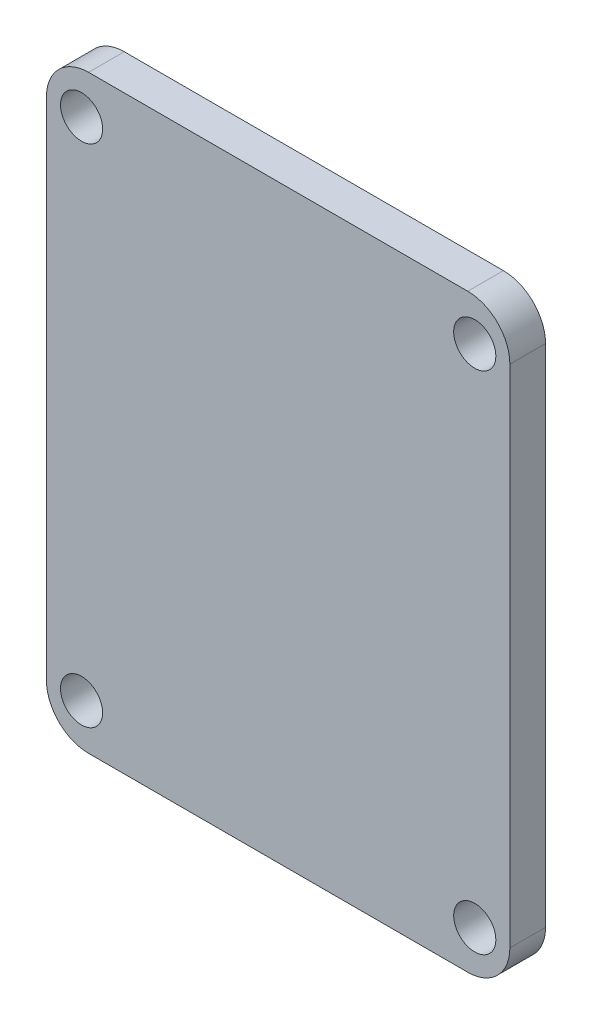
ISO-10303-21;
HEADER;
FILE_DESCRIPTION(('STEP AP214'),'2;1');
FILE_NAME('part.step','',(''),(''),'','','');
FILE_SCHEMA(('AUTOMOTIVE_DESIGN { 1 0 10303 214 1 1 1 1 }'));
ENDSEC;
DATA;
#1=APPLICATION_CONTEXT('core data for automotive mechanical design processes');
#2=APPLICATION_PROTOCOL_DEFINITION('international standard','automotive_design',2000,#1);
#3=PRODUCT_CONTEXT('',#1,'mechanical');
#4=PRODUCT('Part','Part','',(#3));
#5=PRODUCT_RELATED_PRODUCT_CATEGORY('part','',(#4));
#6=PRODUCT_DEFINITION_FORMATION('','',#4);
#7=PRODUCT_DEFINITION_CONTEXT('part definition',#1,'design');
#8=PRODUCT_DEFINITION('design','',#6,#7);
#9=PRODUCT_DEFINITION_SHAPE('','',#8);
#10=(LENGTH_UNIT() NAMED_UNIT(*) SI_UNIT(.MILLI.,.METRE.));
#11=(NAMED_UNIT(*) PLANE_ANGLE_UNIT() SI_UNIT($,.RADIAN.));
#12=(NAMED_UNIT(*) SI_UNIT($,.STERADIAN.) SOLID_ANGLE_UNIT());
#13=UNCERTAINTY_MEASURE_WITH_UNIT(LENGTH_MEASURE(1.E-05),#10,'distance_accuracy_value','');
#14=(GEOMETRIC_REPRESENTATION_CONTEXT(3) GLOBAL_UNCERTAINTY_ASSIGNED_CONTEXT((#13)) GLOBAL_UNIT_ASSIGNED_CONTEXT((#10,
#11,#12)) REPRESENTATION_CONTEXT('',''));
#15=CARTESIAN_POINT('',(0.,0.,0.));
#16=DIRECTION('',(0.,0.,1.));
#17=DIRECTION('',(1.,0.,0.));
#18=AXIS2_PLACEMENT_3D('',#15,#16,#17);
#19=CARTESIAN_POINT('',(0.,0.,2.54));
#20=DIRECTION('',(0.,0.,1.));
#21=DIRECTION('',(1.,0.,0.));
#22=AXIS2_PLACEMENT_3D('',#19,#20,#21);
#23=PLANE('',#22);
#24=CARTESIAN_POINT('',(-14.,18.,2.54));
#25=DIRECTION('',(0.,0.,1.));
#26=DIRECTION('',(1.,0.,0.));
#27=AXIS2_PLACEMENT_3D('',#24,#25,#26);
#28=CIRCLE('',#27,1.5);
#29=CARTESIAN_POINT('',(-12.5,18.,2.54));
#30=VERTEX_POINT('',#29);
#31=EDGE_CURVE('E195',#30,#30,#28,.T.);
#32=ORIENTED_EDGE('',*,*,#31,.F.);
#33=EDGE_LOOP('',(#32));
#34=FACE_BOUND('',#33,.T.);
#35=CARTESIAN_POINT('',(-14.,-18.,2.54));
#36=DIRECTION('',(0.,0.,1.));
#37=DIRECTION('',(1.,0.,0.));
#38=AXIS2_PLACEMENT_3D('',#35,#36,#37);
#39=CIRCLE('',#38,1.5);
#40=CARTESIAN_POINT('',(-12.5,-18.,2.54));
#41=VERTEX_POINT('',#40);
#42=EDGE_CURVE('E135',#41,#41,#39,.T.);
#43=ORIENTED_EDGE('',*,*,#42,.F.);
#44=EDGE_LOOP('',(#43));
#45=FACE_BOUND('',#44,.T.);
#46=DIRECTION('',(0.,1.,0.));
#47=VECTOR('',#46,1.);
#48=CARTESIAN_POINT('',(16.5,-21.,2.54));
#49=LINE('',#48,#47);
#50=CARTESIAN_POINT('',(16.5,-18.,2.54));
#51=VERTEX_POINT('',#50);
#52=CARTESIAN_POINT('',(16.5,18.,2.54));
#53=VERTEX_POINT('',#52);
#54=EDGE_CURVE('E142',#51,#53,#49,.T.);
#55=ORIENTED_EDGE('',*,*,#54,.T.);
#56=CARTESIAN_POINT('',(13.5,18.,2.54));
#57=DIRECTION('',(0.,0.,1.));
#58=DIRECTION('',(1.,0.,0.));
#59=AXIS2_PLACEMENT_3D('',#56,#57,#58);
#60=CIRCLE('',#59,3.);
#61=CARTESIAN_POINT('',(13.5,21.,2.54));
#62=VERTEX_POINT('',#61);
#63=EDGE_CURVE('E161',#53,#62,#60,.T.);
#64=ORIENTED_EDGE('',*,*,#63,.T.);
#65=DIRECTION('',(-1.,0.,0.));
#66=VECTOR('',#65,1.);
#67=CARTESIAN_POINT('',(-16.5,21.,2.54));
#68=LINE('',#67,#66);
#69=CARTESIAN_POINT('',(-13.5,21.,2.54));
#70=VERTEX_POINT('',#69);
#71=EDGE_CURVE('E123',#62,#70,#68,.T.);
#72=ORIENTED_EDGE('',*,*,#71,.T.);
#73=CARTESIAN_POINT('',(-13.5,18.,2.54));
#74=DIRECTION('',(0.,0.,1.));
#75=DIRECTION('',(1.,0.,0.));
#76=AXIS2_PLACEMENT_3D('',#73,#74,#75);
#77=CIRCLE('',#76,3.);
#78=CARTESIAN_POINT('',(-16.5,18.,2.54));
#79=VERTEX_POINT('',#78);
#80=EDGE_CURVE('E157',#70,#79,#77,.T.);
#81=ORIENTED_EDGE('',*,*,#80,.T.);
#82=DIRECTION('',(0.,-1.,0.));
#83=VECTOR('',#82,1.);
#84=CARTESIAN_POINT('',(-16.5,-21.,2.54));
#85=LINE('',#84,#83);
#86=CARTESIAN_POINT('',(-16.5,-18.,2.54));
#87=VERTEX_POINT('',#86);
#88=EDGE_CURVE('E171',#79,#87,#85,.T.);
#89=ORIENTED_EDGE('',*,*,#88,.T.);
#90=CARTESIAN_POINT('',(-13.5,-18.,2.54));
#91=DIRECTION('',(0.,0.,1.));
#92=DIRECTION('',(1.,0.,0.));
#93=AXIS2_PLACEMENT_3D('',#90,#91,#92);
#94=CIRCLE('',#93,3.);
#95=CARTESIAN_POINT('',(-13.5,-21.,2.54));
#96=VERTEX_POINT('',#95);
#97=EDGE_CURVE('E58',#87,#96,#94,.T.);
#98=ORIENTED_EDGE('',*,*,#97,.T.);
#99=DIRECTION('',(1.,0.,0.));
#100=VECTOR('',#99,1.);
#101=CARTESIAN_POINT('',(-16.5,-21.,2.54));
#102=LINE('',#101,#100);
#103=CARTESIAN_POINT('',(13.5,-21.,2.54));
#104=VERTEX_POINT('',#103);
#105=EDGE_CURVE('E178',#96,#104,#102,.T.);
#106=ORIENTED_EDGE('',*,*,#105,.T.);
#107=CARTESIAN_POINT('',(13.5,-18.,2.54));
#108=DIRECTION('',(0.,0.,1.));
#109=DIRECTION('',(1.,0.,0.));
#110=AXIS2_PLACEMENT_3D('',#107,#108,#109);
#111=CIRCLE('',#110,3.);
#112=EDGE_CURVE('E156',#104,#51,#111,.T.);
#113=ORIENTED_EDGE('',*,*,#112,.T.);
#114=EDGE_LOOP('',(#55,#64,#72,#81,#89,#98,#106,#113));
#115=FACE_BOUND('',#114,.T.);
#116=CARTESIAN_POINT('',(14.,-18.,2.54));
#117=DIRECTION('',(0.,0.,1.));
#118=DIRECTION('',(1.,0.,0.));
#119=AXIS2_PLACEMENT_3D('',#116,#117,#118);
#120=CIRCLE('',#119,1.5);
#121=CARTESIAN_POINT('',(15.5,-18.,2.54));
#122=VERTEX_POINT('',#121);
#123=EDGE_CURVE('E186',#122,#122,#120,.T.);
#124=ORIENTED_EDGE('',*,*,#123,.F.);
#125=EDGE_LOOP('',(#124));
#126=FACE_BOUND('',#125,.T.);
#127=CARTESIAN_POINT('',(14.,18.,2.54));
#128=DIRECTION('',(0.,0.,1.));
#129=DIRECTION('',(1.,0.,0.));
#130=AXIS2_PLACEMENT_3D('',#127,#128,#129);
#131=CIRCLE('',#130,1.5);
#132=CARTESIAN_POINT('',(15.5,18.,2.54));
#133=VERTEX_POINT('',#132);
#134=EDGE_CURVE('E196',#133,#133,#131,.T.);
#135=ORIENTED_EDGE('',*,*,#134,.F.);
#136=EDGE_LOOP('',(#135));
#137=FACE_BOUND('',#136,.T.);
#138=ADVANCED_FACE('F39',(#34,#45,#115,#126,#137),#23,.T.);
#139=CARTESIAN_POINT('',(0.,0.,0.));
#140=DIRECTION('',(0.,0.,1.));
#141=DIRECTION('',(1.,0.,0.));
#142=AXIS2_PLACEMENT_3D('',#139,#140,#141);
#143=PLANE('',#142);
#144=DIRECTION('',(-1.,0.,0.));
#145=VECTOR('',#144,1.);
#146=CARTESIAN_POINT('',(-16.5,21.,0.));
#147=LINE('',#146,#145);
#148=CARTESIAN_POINT('',(13.5,21.,0.));
#149=VERTEX_POINT('',#148);
#150=CARTESIAN_POINT('',(-13.5,21.,0.));
#151=VERTEX_POINT('',#150);
#152=EDGE_CURVE('E125',#149,#151,#147,.T.);
#153=ORIENTED_EDGE('',*,*,#152,.F.);
#154=CARTESIAN_POINT('',(13.5,18.,0.));
#155=DIRECTION('',(0.,0.,1.));
#156=DIRECTION('',(1.,0.,0.));
#157=AXIS2_PLACEMENT_3D('',#154,#155,#156);
#158=CIRCLE('',#157,3.);
#159=CARTESIAN_POINT('',(16.5,18.,0.));
#160=VERTEX_POINT('',#159);
#161=EDGE_CURVE('E104',#149,#160,#158,.F.);
#162=ORIENTED_EDGE('',*,*,#161,.T.);
#163=DIRECTION('',(0.,1.,0.));
#164=VECTOR('',#163,1.);
#165=CARTESIAN_POINT('',(16.5,-21.,0.));
#166=LINE('',#165,#164);
#167=CARTESIAN_POINT('',(16.5,-18.,0.));
#168=VERTEX_POINT('',#167);
#169=EDGE_CURVE('E148',#168,#160,#166,.T.);
#170=ORIENTED_EDGE('',*,*,#169,.F.);
#171=CARTESIAN_POINT('',(13.5,-18.,0.));
#172=DIRECTION('',(0.,0.,1.));
#173=DIRECTION('',(1.,0.,0.));
#174=AXIS2_PLACEMENT_3D('',#171,#172,#173);
#175=CIRCLE('',#174,3.);
#176=CARTESIAN_POINT('',(13.5,-21.,0.));
#177=VERTEX_POINT('',#176);
#178=EDGE_CURVE('E127',#168,#177,#175,.F.);
#179=ORIENTED_EDGE('',*,*,#178,.T.);
#180=DIRECTION('',(1.,0.,0.));
#181=VECTOR('',#180,1.);
#182=CARTESIAN_POINT('',(-16.5,-21.,0.));
#183=LINE('',#182,#181);
#184=CARTESIAN_POINT('',(-13.5,-21.,0.));
#185=VERTEX_POINT('',#184);
#186=EDGE_CURVE('E137',#185,#177,#183,.T.);
#187=ORIENTED_EDGE('',*,*,#186,.F.);
#188=CARTESIAN_POINT('',(-13.5,-18.,0.));
#189=DIRECTION('',(0.,0.,1.));
#190=DIRECTION('',(1.,0.,0.));
#191=AXIS2_PLACEMENT_3D('',#188,#189,#190);
#192=CIRCLE('',#191,3.);
#193=CARTESIAN_POINT('',(-16.5,-18.,0.));
#194=VERTEX_POINT('',#193);
#195=EDGE_CURVE('E147',#185,#194,#192,.F.);
#196=ORIENTED_EDGE('',*,*,#195,.T.);
#197=DIRECTION('',(0.,-1.,0.));
#198=VECTOR('',#197,1.);
#199=CARTESIAN_POINT('',(-16.5,-21.,0.));
#200=LINE('',#199,#198);
#201=CARTESIAN_POINT('',(-16.5,18.,0.));
#202=VERTEX_POINT('',#201);
#203=EDGE_CURVE('E131',#202,#194,#200,.T.);
#204=ORIENTED_EDGE('',*,*,#203,.F.);
#205=CARTESIAN_POINT('',(-13.5,18.,0.));
#206=DIRECTION('',(0.,0.,1.));
#207=DIRECTION('',(1.,0.,0.));
#208=AXIS2_PLACEMENT_3D('',#205,#206,#207);
#209=CIRCLE('',#208,3.);
#210=EDGE_CURVE('E119',#202,#151,#209,.F.);
#211=ORIENTED_EDGE('',*,*,#210,.T.);
#212=EDGE_LOOP('',(#153,#162,#170,#179,#187,#196,#204,#211));
#213=FACE_BOUND('',#212,.T.);
#214=CARTESIAN_POINT('',(-14.,-18.,0.));
#215=DIRECTION('',(0.,0.,1.));
#216=DIRECTION('',(1.,0.,0.));
#217=AXIS2_PLACEMENT_3D('',#214,#215,#216);
#218=CIRCLE('',#217,1.5);
#219=CARTESIAN_POINT('',(-12.5,-18.,0.));
#220=VERTEX_POINT('',#219);
#221=EDGE_CURVE('E136',#220,#220,#218,.T.);
#222=ORIENTED_EDGE('',*,*,#221,.T.);
#223=EDGE_LOOP('',(#222));
#224=FACE_BOUND('',#223,.T.);
#225=CARTESIAN_POINT('',(14.,-18.,0.));
#226=DIRECTION('',(0.,0.,1.));
#227=DIRECTION('',(1.,0.,0.));
#228=AXIS2_PLACEMENT_3D('',#225,#226,#227);
#229=CIRCLE('',#228,1.5);
#230=CARTESIAN_POINT('',(15.5,-18.,0.));
#231=VERTEX_POINT('',#230);
#232=EDGE_CURVE('E188',#231,#231,#229,.T.);
#233=ORIENTED_EDGE('',*,*,#232,.T.);
#234=EDGE_LOOP('',(#233));
#235=FACE_BOUND('',#234,.T.);
#236=CARTESIAN_POINT('',(-14.,18.,0.));
#237=DIRECTION('',(0.,0.,1.));
#238=DIRECTION('',(1.,0.,0.));
#239=AXIS2_PLACEMENT_3D('',#236,#237,#238);
#240=CIRCLE('',#239,1.5);
#241=CARTESIAN_POINT('',(-12.5,18.,0.));
#242=VERTEX_POINT('',#241);
#243=EDGE_CURVE('E193',#242,#242,#240,.T.);
#244=ORIENTED_EDGE('',*,*,#243,.T.);
#245=EDGE_LOOP('',(#244));
#246=FACE_BOUND('',#245,.T.);
#247=CARTESIAN_POINT('',(14.,18.,0.));
#248=DIRECTION('',(0.,0.,1.));
#249=DIRECTION('',(1.,0.,0.));
#250=AXIS2_PLACEMENT_3D('',#247,#248,#249);
#251=CIRCLE('',#250,1.5);
#252=CARTESIAN_POINT('',(15.5,18.,0.));
#253=VERTEX_POINT('',#252);
#254=EDGE_CURVE('E203',#253,#253,#251,.T.);
#255=ORIENTED_EDGE('',*,*,#254,.T.);
#256=EDGE_LOOP('',(#255));
#257=FACE_BOUND('',#256,.T.);
#258=ADVANCED_FACE('F129',(#213,#224,#235,#246,#257),#143,.F.);
#259=CARTESIAN_POINT('',(-16.5,21.,2.54));
#260=DIRECTION('',(0.,-1.,0.));
#261=DIRECTION('',(0.,0.,-1.));
#262=AXIS2_PLACEMENT_3D('',#259,#260,#261);
#263=PLANE('',#262);
#264=ORIENTED_EDGE('',*,*,#71,.F.);
#265=DIRECTION('',(0.,0.,-1.));
#266=VECTOR('',#265,1.);
#267=CARTESIAN_POINT('',(13.5,21.,2.54));
#268=LINE('',#267,#266);
#269=EDGE_CURVE('E108',#62,#149,#268,.T.);
#270=ORIENTED_EDGE('',*,*,#269,.T.);
#271=ORIENTED_EDGE('',*,*,#152,.T.);
#272=DIRECTION('',(0.,0.,-1.));
#273=VECTOR('',#272,1.);
#274=CARTESIAN_POINT('',(-13.5,21.,2.54));
#275=LINE('',#274,#273);
#276=EDGE_CURVE('E130',#151,#70,#275,.F.);
#277=ORIENTED_EDGE('',*,*,#276,.T.);
#278=EDGE_LOOP('',(#264,#270,#271,#277));
#279=FACE_BOUND('',#278,.T.);
#280=ADVANCED_FACE('F122',(#279),#263,.F.);
#281=CARTESIAN_POINT('',(-16.5,-21.,2.54));
#282=DIRECTION('',(1.,0.,0.));
#283=DIRECTION('',(0.,0.,-1.));
#284=AXIS2_PLACEMENT_3D('',#281,#282,#283);
#285=PLANE('',#284);
#286=ORIENTED_EDGE('',*,*,#88,.F.);
#287=DIRECTION('',(0.,0.,-1.));
#288=VECTOR('',#287,1.);
#289=CARTESIAN_POINT('',(-16.5,18.,2.54));
#290=LINE('',#289,#288);
#291=EDGE_CURVE('E164',#79,#202,#290,.T.);
#292=ORIENTED_EDGE('',*,*,#291,.T.);
#293=ORIENTED_EDGE('',*,*,#203,.T.);
#294=DIRECTION('',(0.,0.,-1.));
#295=VECTOR('',#294,1.);
#296=CARTESIAN_POINT('',(-16.5,-18.,2.54));
#297=LINE('',#296,#295);
#298=EDGE_CURVE('E162',#194,#87,#297,.F.);
#299=ORIENTED_EDGE('',*,*,#298,.T.);
#300=EDGE_LOOP('',(#286,#292,#293,#299));
#301=FACE_BOUND('',#300,.T.);
#302=ADVANCED_FACE('F168',(#301),#285,.F.);
#303=CARTESIAN_POINT('',(-16.5,-21.,2.54));
#304=DIRECTION('',(0.,1.,0.));
#305=DIRECTION('',(0.,0.,1.));
#306=AXIS2_PLACEMENT_3D('',#303,#304,#305);
#307=PLANE('',#306);
#308=ORIENTED_EDGE('',*,*,#105,.F.);
#309=DIRECTION('',(0.,0.,-1.));
#310=VECTOR('',#309,1.);
#311=CARTESIAN_POINT('',(-13.5,-21.,2.54));
#312=LINE('',#311,#310);
#313=EDGE_CURVE('E11',#96,#185,#312,.T.);
#314=ORIENTED_EDGE('',*,*,#313,.T.);
#315=ORIENTED_EDGE('',*,*,#186,.T.);
#316=DIRECTION('',(0.,0.,-1.));
#317=VECTOR('',#316,1.);
#318=CARTESIAN_POINT('',(13.5,-21.,2.54));
#319=LINE('',#318,#317);
#320=EDGE_CURVE('E50',#177,#104,#319,.F.);
#321=ORIENTED_EDGE('',*,*,#320,.T.);
#322=EDGE_LOOP('',(#308,#314,#315,#321));
#323=FACE_BOUND('',#322,.T.);
#324=ADVANCED_FACE('F176',(#323),#307,.F.);
#325=CARTESIAN_POINT('',(16.5,-21.,2.54));
#326=DIRECTION('',(-1.,0.,0.));
#327=DIRECTION('',(0.,0.,1.));
#328=AXIS2_PLACEMENT_3D('',#325,#326,#327);
#329=PLANE('',#328);
#330=ORIENTED_EDGE('',*,*,#169,.T.);
#331=DIRECTION('',(0.,0.,-1.));
#332=VECTOR('',#331,1.);
#333=CARTESIAN_POINT('',(16.5,18.,2.54));
#334=LINE('',#333,#332);
#335=EDGE_CURVE('E109',#160,#53,#334,.F.);
#336=ORIENTED_EDGE('',*,*,#335,.T.);
#337=ORIENTED_EDGE('',*,*,#54,.F.);
#338=DIRECTION('',(0.,0.,-1.));
#339=VECTOR('',#338,1.);
#340=CARTESIAN_POINT('',(16.5,-18.,2.54));
#341=LINE('',#340,#339);
#342=EDGE_CURVE('E113',#51,#168,#341,.T.);
#343=ORIENTED_EDGE('',*,*,#342,.T.);
#344=EDGE_LOOP('',(#330,#336,#337,#343));
#345=FACE_BOUND('',#344,.T.);
#346=ADVANCED_FACE('F221',(#345),#329,.F.);
#347=CARTESIAN_POINT('',(-14.,-18.,2.54));
#348=DIRECTION('',(0.,0.,-1.));
#349=DIRECTION('',(-1.,0.,0.));
#350=AXIS2_PLACEMENT_3D('',#347,#348,#349);
#351=CYLINDRICAL_SURFACE('',#350,1.5);
#352=ORIENTED_EDGE('',*,*,#42,.T.);
#353=EDGE_LOOP('',(#352));
#354=FACE_BOUND('',#353,.T.);
#355=ORIENTED_EDGE('',*,*,#221,.F.);
#356=EDGE_LOOP('',(#355));
#357=FACE_BOUND('',#356,.T.);
#358=ADVANCED_FACE('F222',(#354,#357),#351,.F.);
#359=CARTESIAN_POINT('',(14.,-18.,2.54));
#360=DIRECTION('',(0.,0.,-1.));
#361=DIRECTION('',(-1.,0.,0.));
#362=AXIS2_PLACEMENT_3D('',#359,#360,#361);
#363=CYLINDRICAL_SURFACE('',#362,1.5);
#364=ORIENTED_EDGE('',*,*,#123,.T.);
#365=EDGE_LOOP('',(#364));
#366=FACE_BOUND('',#365,.T.);
#367=ORIENTED_EDGE('',*,*,#232,.F.);
#368=EDGE_LOOP('',(#367));
#369=FACE_BOUND('',#368,.T.);
#370=ADVANCED_FACE('F248',(#366,#369),#363,.F.);
#371=CARTESIAN_POINT('',(-14.,18.,2.54));
#372=DIRECTION('',(0.,0.,-1.));
#373=DIRECTION('',(-1.,0.,0.));
#374=AXIS2_PLACEMENT_3D('',#371,#372,#373);
#375=CYLINDRICAL_SURFACE('',#374,1.5);
#376=ORIENTED_EDGE('',*,*,#31,.T.);
#377=EDGE_LOOP('',(#376));
#378=FACE_BOUND('',#377,.T.);
#379=ORIENTED_EDGE('',*,*,#243,.F.);
#380=EDGE_LOOP('',(#379));
#381=FACE_BOUND('',#380,.T.);
#382=ADVANCED_FACE('F251',(#378,#381),#375,.F.);
#383=CARTESIAN_POINT('',(14.,18.,2.54));
#384=DIRECTION('',(0.,0.,-1.));
#385=DIRECTION('',(-1.,0.,0.));
#386=AXIS2_PLACEMENT_3D('',#383,#384,#385);
#387=CYLINDRICAL_SURFACE('',#386,1.5);
#388=ORIENTED_EDGE('',*,*,#134,.T.);
#389=EDGE_LOOP('',(#388));
#390=FACE_BOUND('',#389,.T.);
#391=ORIENTED_EDGE('',*,*,#254,.F.);
#392=EDGE_LOOP('',(#391));
#393=FACE_BOUND('',#392,.T.);
#394=ADVANCED_FACE('F210',(#390,#393),#387,.F.);
#395=CARTESIAN_POINT('',(13.5,18.,2.54));
#396=DIRECTION('',(0.,0.,-1.));
#397=DIRECTION('',(-1.,0.,0.));
#398=AXIS2_PLACEMENT_3D('',#395,#396,#397);
#399=CYLINDRICAL_SURFACE('',#398,3.);
#400=ORIENTED_EDGE('',*,*,#63,.F.);
#401=ORIENTED_EDGE('',*,*,#335,.F.);
#402=ORIENTED_EDGE('',*,*,#161,.F.);
#403=ORIENTED_EDGE('',*,*,#269,.F.);
#404=EDGE_LOOP('',(#400,#401,#402,#403));
#405=FACE_BOUND('',#404,.T.);
#406=ADVANCED_FACE('F107',(#405),#399,.T.);
#407=CARTESIAN_POINT('',(-13.5,18.,2.54));
#408=DIRECTION('',(0.,0.,-1.));
#409=DIRECTION('',(-1.,0.,0.));
#410=AXIS2_PLACEMENT_3D('',#407,#408,#409);
#411=CYLINDRICAL_SURFACE('',#410,3.);
#412=ORIENTED_EDGE('',*,*,#80,.F.);
#413=ORIENTED_EDGE('',*,*,#276,.F.);
#414=ORIENTED_EDGE('',*,*,#210,.F.);
#415=ORIENTED_EDGE('',*,*,#291,.F.);
#416=EDGE_LOOP('',(#412,#413,#414,#415));
#417=FACE_BOUND('',#416,.T.);
#418=ADVANCED_FACE('F237',(#417),#411,.T.);
#419=CARTESIAN_POINT('',(-13.5,-18.,2.54));
#420=DIRECTION('',(0.,0.,-1.));
#421=DIRECTION('',(-1.,0.,0.));
#422=AXIS2_PLACEMENT_3D('',#419,#420,#421);
#423=CYLINDRICAL_SURFACE('',#422,3.);
#424=ORIENTED_EDGE('',*,*,#97,.F.);
#425=ORIENTED_EDGE('',*,*,#298,.F.);
#426=ORIENTED_EDGE('',*,*,#195,.F.);
#427=ORIENTED_EDGE('',*,*,#313,.F.);
#428=EDGE_LOOP('',(#424,#425,#426,#427));
#429=FACE_BOUND('',#428,.T.);
#430=ADVANCED_FACE('F179',(#429),#423,.T.);
#431=CARTESIAN_POINT('',(13.5,-18.,2.54));
#432=DIRECTION('',(0.,0.,-1.));
#433=DIRECTION('',(-1.,0.,0.));
#434=AXIS2_PLACEMENT_3D('',#431,#432,#433);
#435=CYLINDRICAL_SURFACE('',#434,3.);
#436=ORIENTED_EDGE('',*,*,#112,.F.);
#437=ORIENTED_EDGE('',*,*,#320,.F.);
#438=ORIENTED_EDGE('',*,*,#178,.F.);
#439=ORIENTED_EDGE('',*,*,#342,.F.);
#440=EDGE_LOOP('',(#436,#437,#438,#439));
#441=FACE_BOUND('',#440,.T.);
#442=ADVANCED_FACE('F41',(#441),#435,.T.);
#443=CLOSED_SHELL('',(#138,#258,#280,#302,#324,#346,#358,#370,#382,#394,#406,#418,#430,#442));
#444=MANIFOLD_SOLID_BREP('B2',#443);
#445=ADVANCED_BREP_SHAPE_REPRESENTATION('',(#18,#444),#14);
#446=SHAPE_DEFINITION_REPRESENTATION(#9,#445);
ENDSEC;
END-ISO-10303-21;
